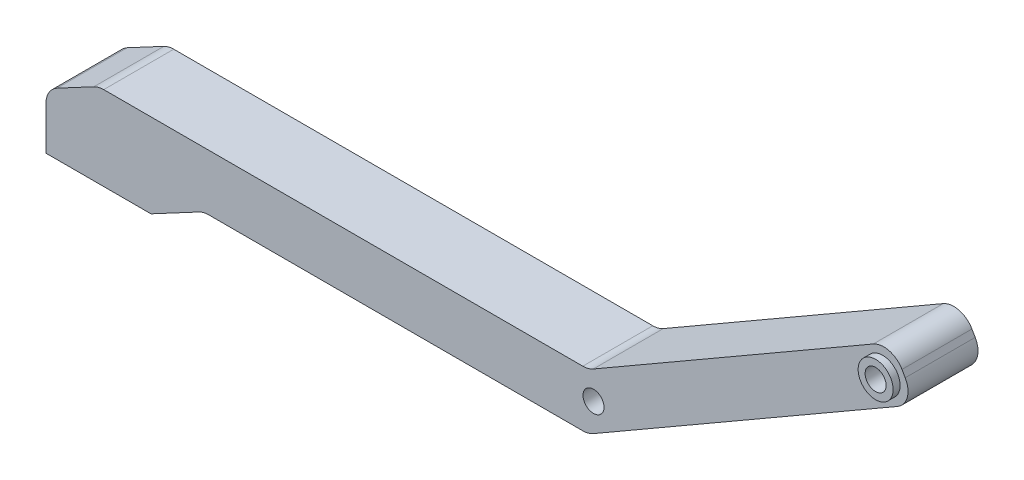
ISO-10303-21;
HEADER;
FILE_DESCRIPTION(('STEP AP214'),'2;1');
FILE_NAME('part.step','',(''),(''),'','','');
FILE_SCHEMA(('AUTOMOTIVE_DESIGN { 1 0 10303 214 1 1 1 1 }'));
ENDSEC;
DATA;
#1=APPLICATION_CONTEXT('core data for automotive mechanical design processes');
#2=APPLICATION_PROTOCOL_DEFINITION('international standard','automotive_design',2000,#1);
#3=PRODUCT_CONTEXT('',#1,'mechanical');
#4=PRODUCT('Part','Part','',(#3));
#5=PRODUCT_RELATED_PRODUCT_CATEGORY('part','',(#4));
#6=PRODUCT_DEFINITION_FORMATION('','',#4);
#7=PRODUCT_DEFINITION_CONTEXT('part definition',#1,'design');
#8=PRODUCT_DEFINITION('design','',#6,#7);
#9=PRODUCT_DEFINITION_SHAPE('','',#8);
#10=(LENGTH_UNIT() NAMED_UNIT(*) SI_UNIT(.MILLI.,.METRE.));
#11=(NAMED_UNIT(*) PLANE_ANGLE_UNIT() SI_UNIT($,.RADIAN.));
#12=(NAMED_UNIT(*) SI_UNIT($,.STERADIAN.) SOLID_ANGLE_UNIT());
#13=UNCERTAINTY_MEASURE_WITH_UNIT(LENGTH_MEASURE(1.E-05),#10,'distance_accuracy_value','');
#14=(GEOMETRIC_REPRESENTATION_CONTEXT(3) GLOBAL_UNCERTAINTY_ASSIGNED_CONTEXT((#13)) GLOBAL_UNIT_ASSIGNED_CONTEXT((#10,
#11,#12)) REPRESENTATION_CONTEXT('',''));
#15=CARTESIAN_POINT('',(0.,0.,0.));
#16=DIRECTION('',(0.,0.,1.));
#17=DIRECTION('',(1.,0.,0.));
#18=AXIS2_PLACEMENT_3D('',#15,#16,#17);
#19=CARTESIAN_POINT('',(0.,0.,10.));
#20=DIRECTION('',(0.,0.,1.));
#21=DIRECTION('',(1.,0.,0.));
#22=AXIS2_PLACEMENT_3D('',#19,#20,#21);
#23=PLANE('',#22);
#24=CARTESIAN_POINT('',(70.727461339179,4.42000000000001,10.));
#25=DIRECTION('',(0.,0.,1.));
#26=DIRECTION('',(1.,0.,0.));
#27=AXIS2_PLACEMENT_3D('',#24,#25,#26);
#28=CIRCLE('',#27,1.5);
#29=CARTESIAN_POINT('',(72.227461339179,4.42000000000001,10.));
#30=VERTEX_POINT('',#29);
#31=EDGE_CURVE('E351',#30,#30,#28,.T.);
#32=ORIENTED_EDGE('',*,*,#31,.F.);
#33=EDGE_LOOP('',(#32));
#34=FACE_BOUND('',#33,.T.);
#35=DIRECTION('',(-0.500000000000005,0.866025403784436,0.));
#36=VECTOR('',#35,1.);
#37=CARTESIAN_POINT('',(116.76537180436,27.,10.));
#38=LINE('',#37,#36);
#39=CARTESIAN_POINT('',(115.26537180436,29.5980762113533,10.));
#40=VERTEX_POINT('',#39);
#41=CARTESIAN_POINT('',(114.801270189222,30.4019237886467,10.));
#42=VERTEX_POINT('',#41);
#43=EDGE_CURVE('E333',#40,#42,#38,.T.);
#44=ORIENTED_EDGE('',*,*,#43,.T.);
#45=CARTESIAN_POINT('',(112.203193977869,28.9019237886467,10.));
#46=DIRECTION('',(0.,0.,1.));
#47=DIRECTION('',(1.,0.,0.));
#48=AXIS2_PLACEMENT_3D('',#45,#46,#47);
#49=CIRCLE('',#48,3.);
#50=CARTESIAN_POINT('',(110.703193977869,31.5,10.));
#51=VERTEX_POINT('',#50);
#52=EDGE_CURVE('E274',#42,#51,#49,.T.);
#53=ORIENTED_EDGE('',*,*,#52,.T.);
#54=DIRECTION('',(-0.866025403784439,-0.5,0.));
#55=VECTOR('',#54,1.);
#56=CARTESIAN_POINT('',(70.,8.,10.));
#57=LINE('',#56,#55);
#58=CARTESIAN_POINT('',(70.6961524227066,8.40192378864668,10.));
#59=VERTEX_POINT('',#58);
#60=EDGE_CURVE('E325',#51,#59,#57,.T.);
#61=ORIENTED_EDGE('',*,*,#60,.T.);
#62=CARTESIAN_POINT('',(69.1961524227066,11.,10.));
#63=DIRECTION('',(0.,0.,1.));
#64=DIRECTION('',(1.,0.,0.));
#65=AXIS2_PLACEMENT_3D('',#62,#63,#64);
#66=CIRCLE('',#65,3.);
#67=CARTESIAN_POINT('',(69.1961524227066,8.,10.));
#68=VERTEX_POINT('',#67);
#69=EDGE_CURVE('E11',#59,#68,#66,.F.);
#70=ORIENTED_EDGE('',*,*,#69,.T.);
#71=DIRECTION('',(-1.,0.,0.));
#72=VECTOR('',#71,1.);
#73=CARTESIAN_POINT('',(0.,8.,10.));
#74=LINE('',#73,#72);
#75=CARTESIAN_POINT('',(0.749999999999999,8.,10.));
#76=VERTEX_POINT('',#75);
#77=EDGE_CURVE('E323',#68,#76,#74,.T.);
#78=ORIENTED_EDGE('',*,*,#77,.T.);
#79=CARTESIAN_POINT('',(0.749999999999999,5.,10.));
#80=DIRECTION('',(0.,0.,1.));
#81=DIRECTION('',(1.,0.,0.));
#82=AXIS2_PLACEMENT_3D('',#79,#80,#81);
#83=CIRCLE('',#82,3.);
#84=CARTESIAN_POINT('',(-0.661764705882355,7.64705882352941,10.));
#85=VERTEX_POINT('',#84);
#86=EDGE_CURVE('E265',#76,#85,#83,.T.);
#87=ORIENTED_EDGE('',*,*,#86,.T.);
#88=DIRECTION('',(-0.882352941176471,-0.470588235294118,0.));
#89=VECTOR('',#88,1.);
#90=CARTESIAN_POINT('',(0.,8.,10.));
#91=LINE('',#90,#89);
#92=CARTESIAN_POINT('',(-5.91176470588236,4.84705882352941,10.));
#93=VERTEX_POINT('',#92);
#94=EDGE_CURVE('E169',#85,#93,#91,.T.);
#95=ORIENTED_EDGE('',*,*,#94,.T.);
#96=CARTESIAN_POINT('',(-4.5,2.2,10.));
#97=DIRECTION('',(0.,0.,1.));
#98=DIRECTION('',(1.,0.,0.));
#99=AXIS2_PLACEMENT_3D('',#96,#97,#98);
#100=CIRCLE('',#99,3.);
#101=CARTESIAN_POINT('',(-7.5,2.2,10.));
#102=VERTEX_POINT('',#101);
#103=EDGE_CURVE('E61',#93,#102,#100,.T.);
#104=ORIENTED_EDGE('',*,*,#103,.T.);
#105=DIRECTION('',(0.,-1.,0.));
#106=VECTOR('',#105,1.);
#107=CARTESIAN_POINT('',(-7.5,4.,10.));
#108=LINE('',#107,#106);
#109=CARTESIAN_POINT('',(-7.5,-4.,10.));
#110=VERTEX_POINT('',#109);
#111=EDGE_CURVE('E157',#102,#110,#108,.T.);
#112=ORIENTED_EDGE('',*,*,#111,.T.);
#113=DIRECTION('',(1.,0.,0.));
#114=VECTOR('',#113,1.);
#115=CARTESIAN_POINT('',(-7.5,-4.,10.));
#116=LINE('',#115,#114);
#117=CARTESIAN_POINT('',(7.5,-4.,10.));
#118=VERTEX_POINT('',#117);
#119=EDGE_CURVE('E163',#110,#118,#116,.T.);
#120=ORIENTED_EDGE('',*,*,#119,.T.);
#121=DIRECTION('',(0.882352941176471,0.470588235294118,0.));
#122=VECTOR('',#121,1.);
#123=CARTESIAN_POINT('',(7.5,-4.,10.));
#124=LINE('',#123,#122);
#125=CARTESIAN_POINT('',(14.3382352941176,-0.352941176470585,10.));
#126=VERTEX_POINT('',#125);
#127=EDGE_CURVE('E223',#118,#126,#124,.T.);
#128=ORIENTED_EDGE('',*,*,#127,.T.);
#129=CARTESIAN_POINT('',(15.75,-3.,10.));
#130=DIRECTION('',(0.,0.,1.));
#131=DIRECTION('',(1.,0.,0.));
#132=AXIS2_PLACEMENT_3D('',#129,#130,#131);
#133=CIRCLE('',#132,3.);
#134=CARTESIAN_POINT('',(15.75,0.,10.));
#135=VERTEX_POINT('',#134);
#136=EDGE_CURVE('E303',#126,#135,#133,.F.);
#137=ORIENTED_EDGE('',*,*,#136,.T.);
#138=DIRECTION('',(1.,0.,0.));
#139=VECTOR('',#138,1.);
#140=CARTESIAN_POINT('',(15.,0.,10.));
#141=LINE('',#140,#139);
#142=CARTESIAN_POINT('',(69.1961524227066,0.,10.));
#143=VERTEX_POINT('',#142);
#144=EDGE_CURVE('E342',#135,#143,#141,.T.);
#145=ORIENTED_EDGE('',*,*,#144,.T.);
#146=CARTESIAN_POINT('',(69.1961524227066,3.,10.));
#147=DIRECTION('',(0.,0.,1.));
#148=DIRECTION('',(1.,0.,0.));
#149=AXIS2_PLACEMENT_3D('',#146,#147,#148);
#150=CIRCLE('',#149,3.);
#151=CARTESIAN_POINT('',(70.6961524227066,0.40192378864668,10.));
#152=VERTEX_POINT('',#151);
#153=EDGE_CURVE('E268',#143,#152,#150,.T.);
#154=ORIENTED_EDGE('',*,*,#153,.T.);
#155=DIRECTION('',(0.866025403784439,0.5,0.));
#156=VECTOR('',#155,1.);
#157=CARTESIAN_POINT('',(70.,0.,10.));
#158=LINE('',#157,#156);
#159=CARTESIAN_POINT('',(114.167295593006,25.5,10.));
#160=VERTEX_POINT('',#159);
#161=EDGE_CURVE('E338',#152,#160,#158,.T.);
#162=ORIENTED_EDGE('',*,*,#161,.T.);
#163=CARTESIAN_POINT('',(112.667295593006,28.0980762113533,10.));
#164=DIRECTION('',(0.,0.,1.));
#165=DIRECTION('',(1.,0.,0.));
#166=AXIS2_PLACEMENT_3D('',#163,#164,#165);
#167=CIRCLE('',#166,3.);
#168=EDGE_CURVE('E271',#160,#40,#167,.T.);
#169=ORIENTED_EDGE('',*,*,#168,.T.);
#170=EDGE_LOOP('',(#44,#53,#61,#70,#78,#87,#95,#104,#112,#120,#128,#137,#145,#154,#162,#169));
#171=FACE_BOUND('',#170,.T.);
#172=CARTESIAN_POINT('',(112.036873099697,28.27,10.));
#173=DIRECTION('',(0.,0.,1.));
#174=DIRECTION('',(1.,0.,0.));
#175=AXIS2_PLACEMENT_3D('',#172,#173,#174);
#176=CIRCLE('',#175,2.5);
#177=CARTESIAN_POINT('',(114.536873099697,28.27,10.));
#178=VERTEX_POINT('',#177);
#179=EDGE_CURVE('E360',#178,#178,#176,.T.);
#180=ORIENTED_EDGE('',*,*,#179,.F.);
#181=EDGE_LOOP('',(#180));
#182=FACE_BOUND('',#181,.T.);
#183=ADVANCED_FACE('F45',(#34,#171,#182),#23,.T.);
#184=CARTESIAN_POINT('',(0.,0.,0.));
#185=DIRECTION('',(0.,0.,1.));
#186=DIRECTION('',(1.,0.,0.));
#187=AXIS2_PLACEMENT_3D('',#184,#185,#186);
#188=PLANE('',#187);
#189=DIRECTION('',(-0.866025403784439,-0.5,0.));
#190=VECTOR('',#189,1.);
#191=CARTESIAN_POINT('',(70.,8.,0.));
#192=LINE('',#191,#190);
#193=CARTESIAN_POINT('',(110.703193977869,31.5,0.));
#194=VERTEX_POINT('',#193);
#195=CARTESIAN_POINT('',(70.6961524227066,8.40192378864668,0.));
#196=VERTEX_POINT('',#195);
#197=EDGE_CURVE('E208',#194,#196,#192,.T.);
#198=ORIENTED_EDGE('',*,*,#197,.F.);
#199=CARTESIAN_POINT('',(112.203193977869,28.9019237886467,0.));
#200=DIRECTION('',(0.,0.,1.));
#201=DIRECTION('',(1.,0.,0.));
#202=AXIS2_PLACEMENT_3D('',#199,#200,#201);
#203=CIRCLE('',#202,3.);
#204=CARTESIAN_POINT('',(114.801270189222,30.4019237886467,0.));
#205=VERTEX_POINT('',#204);
#206=EDGE_CURVE('E253',#194,#205,#203,.F.);
#207=ORIENTED_EDGE('',*,*,#206,.T.);
#208=DIRECTION('',(-0.500000000000005,0.866025403784436,0.));
#209=VECTOR('',#208,1.);
#210=CARTESIAN_POINT('',(116.76537180436,27.,0.));
#211=LINE('',#210,#209);
#212=CARTESIAN_POINT('',(115.26537180436,29.5980762113533,0.));
#213=VERTEX_POINT('',#212);
#214=EDGE_CURVE('E204',#213,#205,#211,.T.);
#215=ORIENTED_EDGE('',*,*,#214,.F.);
#216=CARTESIAN_POINT('',(112.667295593006,28.0980762113533,0.));
#217=DIRECTION('',(0.,0.,1.));
#218=DIRECTION('',(1.,0.,0.));
#219=AXIS2_PLACEMENT_3D('',#216,#217,#218);
#220=CIRCLE('',#219,3.);
#221=CARTESIAN_POINT('',(114.167295593006,25.5,0.));
#222=VERTEX_POINT('',#221);
#223=EDGE_CURVE('E250',#213,#222,#220,.F.);
#224=ORIENTED_EDGE('',*,*,#223,.T.);
#225=DIRECTION('',(0.866025403784439,0.5,0.));
#226=VECTOR('',#225,1.);
#227=CARTESIAN_POINT('',(70.,0.,0.));
#228=LINE('',#227,#226);
#229=CARTESIAN_POINT('',(70.6961524227066,0.40192378864668,0.));
#230=VERTEX_POINT('',#229);
#231=EDGE_CURVE('E200',#230,#222,#228,.T.);
#232=ORIENTED_EDGE('',*,*,#231,.F.);
#233=CARTESIAN_POINT('',(69.1961524227066,3.,0.));
#234=DIRECTION('',(0.,0.,1.));
#235=DIRECTION('',(1.,0.,0.));
#236=AXIS2_PLACEMENT_3D('',#233,#234,#235);
#237=CIRCLE('',#236,3.);
#238=CARTESIAN_POINT('',(69.1961524227066,0.,0.));
#239=VERTEX_POINT('',#238);
#240=EDGE_CURVE('E247',#230,#239,#237,.F.);
#241=ORIENTED_EDGE('',*,*,#240,.T.);
#242=DIRECTION('',(1.,0.,0.));
#243=VECTOR('',#242,1.);
#244=CARTESIAN_POINT('',(15.,0.,0.));
#245=LINE('',#244,#243);
#246=CARTESIAN_POINT('',(15.75,0.,0.));
#247=VERTEX_POINT('',#246);
#248=EDGE_CURVE('E195',#247,#239,#245,.T.);
#249=ORIENTED_EDGE('',*,*,#248,.F.);
#250=CARTESIAN_POINT('',(15.75,-3.,0.));
#251=DIRECTION('',(0.,0.,1.));
#252=DIRECTION('',(1.,0.,0.));
#253=AXIS2_PLACEMENT_3D('',#250,#251,#252);
#254=CIRCLE('',#253,3.);
#255=CARTESIAN_POINT('',(14.3382352941176,-0.352941176470585,0.));
#256=VERTEX_POINT('',#255);
#257=EDGE_CURVE('E300',#247,#256,#254,.T.);
#258=ORIENTED_EDGE('',*,*,#257,.T.);
#259=DIRECTION('',(0.882352941176471,0.470588235294118,0.));
#260=VECTOR('',#259,1.);
#261=CARTESIAN_POINT('',(7.5,-4.,0.));
#262=LINE('',#261,#260);
#263=CARTESIAN_POINT('',(7.5,-4.,0.));
#264=VERTEX_POINT('',#263);
#265=EDGE_CURVE('E191',#264,#256,#262,.T.);
#266=ORIENTED_EDGE('',*,*,#265,.F.);
#267=DIRECTION('',(1.,0.,0.));
#268=VECTOR('',#267,1.);
#269=CARTESIAN_POINT('',(-7.5,-4.,0.));
#270=LINE('',#269,#268);
#271=CARTESIAN_POINT('',(-7.5,-4.,0.));
#272=VERTEX_POINT('',#271);
#273=EDGE_CURVE('E221',#272,#264,#270,.T.);
#274=ORIENTED_EDGE('',*,*,#273,.F.);
#275=DIRECTION('',(0.,-1.,0.));
#276=VECTOR('',#275,1.);
#277=CARTESIAN_POINT('',(-7.5,4.,0.));
#278=LINE('',#277,#276);
#279=CARTESIAN_POINT('',(-7.5,2.2,0.));
#280=VERTEX_POINT('',#279);
#281=EDGE_CURVE('E175',#280,#272,#278,.T.);
#282=ORIENTED_EDGE('',*,*,#281,.F.);
#283=CARTESIAN_POINT('',(-4.5,2.2,0.));
#284=DIRECTION('',(0.,0.,1.));
#285=DIRECTION('',(1.,0.,0.));
#286=AXIS2_PLACEMENT_3D('',#283,#284,#285);
#287=CIRCLE('',#286,3.);
#288=CARTESIAN_POINT('',(-5.91176470588236,4.84705882352941,0.));
#289=VERTEX_POINT('',#288);
#290=EDGE_CURVE('E241',#280,#289,#287,.F.);
#291=ORIENTED_EDGE('',*,*,#290,.T.);
#292=DIRECTION('',(-0.882352941176471,-0.470588235294118,0.));
#293=VECTOR('',#292,1.);
#294=CARTESIAN_POINT('',(0.,8.,0.));
#295=LINE('',#294,#293);
#296=CARTESIAN_POINT('',(-0.661764705882355,7.64705882352941,0.));
#297=VERTEX_POINT('',#296);
#298=EDGE_CURVE('E216',#297,#289,#295,.T.);
#299=ORIENTED_EDGE('',*,*,#298,.F.);
#300=CARTESIAN_POINT('',(0.749999999999999,5.,0.));
#301=DIRECTION('',(0.,0.,1.));
#302=DIRECTION('',(1.,0.,0.));
#303=AXIS2_PLACEMENT_3D('',#300,#301,#302);
#304=CIRCLE('',#303,3.);
#305=CARTESIAN_POINT('',(0.749999999999999,8.,0.));
#306=VERTEX_POINT('',#305);
#307=EDGE_CURVE('E244',#297,#306,#304,.F.);
#308=ORIENTED_EDGE('',*,*,#307,.T.);
#309=DIRECTION('',(-1.,0.,0.));
#310=VECTOR('',#309,1.);
#311=CARTESIAN_POINT('',(0.,8.,0.));
#312=LINE('',#311,#310);
#313=CARTESIAN_POINT('',(69.1961524227066,8.,0.));
#314=VERTEX_POINT('',#313);
#315=EDGE_CURVE('E212',#314,#306,#312,.T.);
#316=ORIENTED_EDGE('',*,*,#315,.F.);
#317=CARTESIAN_POINT('',(69.1961524227066,11.,0.));
#318=DIRECTION('',(0.,0.,1.));
#319=DIRECTION('',(1.,0.,0.));
#320=AXIS2_PLACEMENT_3D('',#317,#318,#319);
#321=CIRCLE('',#320,3.);
#322=EDGE_CURVE('E54',#314,#196,#321,.T.);
#323=ORIENTED_EDGE('',*,*,#322,.T.);
#324=EDGE_LOOP('',(#198,#207,#215,#224,#232,#241,#249,#258,#266,#274,#282,#291,#299,#308,#316,#323));
#325=FACE_BOUND('',#324,.T.);
#326=CARTESIAN_POINT('',(112.036873099697,28.27,0.));
#327=DIRECTION('',(0.,0.,1.));
#328=DIRECTION('',(1.,0.,0.));
#329=AXIS2_PLACEMENT_3D('',#326,#327,#328);
#330=CIRCLE('',#329,1.5);
#331=CARTESIAN_POINT('',(113.536873099697,28.27,0.));
#332=VERTEX_POINT('',#331);
#333=EDGE_CURVE('E196',#332,#332,#330,.T.);
#334=ORIENTED_EDGE('',*,*,#333,.T.);
#335=EDGE_LOOP('',(#334));
#336=FACE_BOUND('',#335,.T.);
#337=CARTESIAN_POINT('',(70.727461339179,4.42000000000001,0.));
#338=DIRECTION('',(0.,0.,1.));
#339=DIRECTION('',(1.,0.,0.));
#340=AXIS2_PLACEMENT_3D('',#337,#338,#339);
#341=CIRCLE('',#340,1.5);
#342=CARTESIAN_POINT('',(72.227461339179,4.42000000000001,0.));
#343=VERTEX_POINT('',#342);
#344=EDGE_CURVE('E352',#343,#343,#341,.T.);
#345=ORIENTED_EDGE('',*,*,#344,.T.);
#346=EDGE_LOOP('',(#345));
#347=FACE_BOUND('',#346,.T.);
#348=ADVANCED_FACE('F309',(#325,#336,#347),#188,.F.);
#349=CARTESIAN_POINT('',(7.5,-4.,10.));
#350=DIRECTION('',(-0.470588235294118,0.882352941176471,0.));
#351=DIRECTION('',(-0.882352941176471,-0.470588235294118,0.));
#352=AXIS2_PLACEMENT_3D('',#349,#350,#351);
#353=PLANE('',#352);
#354=ORIENTED_EDGE('',*,*,#265,.T.);
#355=DIRECTION('',(0.,0.,-1.));
#356=VECTOR('',#355,1.);
#357=CARTESIAN_POINT('',(14.3382352941176,-0.352941176470585,10.));
#358=LINE('',#357,#356);
#359=EDGE_CURVE('E231',#256,#126,#358,.F.);
#360=ORIENTED_EDGE('',*,*,#359,.T.);
#361=ORIENTED_EDGE('',*,*,#127,.F.);
#362=DIRECTION('',(0.,0.,-1.));
#363=VECTOR('',#362,1.);
#364=CARTESIAN_POINT('',(7.5,-4.,10.));
#365=LINE('',#364,#363);
#366=EDGE_CURVE('E180',#118,#264,#365,.T.);
#367=ORIENTED_EDGE('',*,*,#366,.T.);
#368=EDGE_LOOP('',(#354,#360,#361,#367));
#369=FACE_BOUND('',#368,.T.);
#370=ADVANCED_FACE('F394',(#369),#353,.F.);
#371=CARTESIAN_POINT('',(15.,0.,10.));
#372=DIRECTION('',(0.,1.,0.));
#373=DIRECTION('',(-1.,0.,0.));
#374=AXIS2_PLACEMENT_3D('',#371,#372,#373);
#375=PLANE('',#374);
#376=ORIENTED_EDGE('',*,*,#144,.F.);
#377=DIRECTION('',(0.,0.,-1.));
#378=VECTOR('',#377,1.);
#379=CARTESIAN_POINT('',(15.75,0.,0.));
#380=LINE('',#379,#378);
#381=EDGE_CURVE('E227',#135,#247,#380,.T.);
#382=ORIENTED_EDGE('',*,*,#381,.T.);
#383=ORIENTED_EDGE('',*,*,#248,.T.);
#384=DIRECTION('',(0.,0.,-1.));
#385=VECTOR('',#384,1.);
#386=CARTESIAN_POINT('',(69.1961524227066,0.,10.));
#387=LINE('',#386,#385);
#388=EDGE_CURVE('E179',#239,#143,#387,.F.);
#389=ORIENTED_EDGE('',*,*,#388,.T.);
#390=EDGE_LOOP('',(#376,#382,#383,#389));
#391=FACE_BOUND('',#390,.T.);
#392=ADVANCED_FACE('F418',(#391),#375,.F.);
#393=CARTESIAN_POINT('',(70.,0.,10.));
#394=DIRECTION('',(-0.5,0.866025403784439,0.));
#395=DIRECTION('',(-0.866025403784439,-0.5,0.));
#396=AXIS2_PLACEMENT_3D('',#393,#394,#395);
#397=PLANE('',#396);
#398=ORIENTED_EDGE('',*,*,#231,.T.);
#399=DIRECTION('',(0.,0.,-1.));
#400=VECTOR('',#399,1.);
#401=CARTESIAN_POINT('',(114.167295593006,25.5,10.));
#402=LINE('',#401,#400);
#403=EDGE_CURVE('E281',#222,#160,#402,.F.);
#404=ORIENTED_EDGE('',*,*,#403,.T.);
#405=ORIENTED_EDGE('',*,*,#161,.F.);
#406=DIRECTION('',(0.,0.,-1.));
#407=VECTOR('',#406,1.);
#408=CARTESIAN_POINT('',(70.6961524227066,0.40192378864668,10.));
#409=LINE('',#408,#407);
#410=EDGE_CURVE('E277',#152,#230,#409,.T.);
#411=ORIENTED_EDGE('',*,*,#410,.T.);
#412=EDGE_LOOP('',(#398,#404,#405,#411));
#413=FACE_BOUND('',#412,.T.);
#414=ADVANCED_FACE('F414',(#413),#397,.F.);
#415=CARTESIAN_POINT('',(116.76537180436,27.,10.));
#416=DIRECTION('',(-0.866025403784436,-0.500000000000004,0.));
#417=DIRECTION('',(0.500000000000004,-0.866025403784436,0.));
#418=AXIS2_PLACEMENT_3D('',#415,#416,#417);
#419=PLANE('',#418);
#420=ORIENTED_EDGE('',*,*,#214,.T.);
#421=DIRECTION('',(0.,0.,-1.));
#422=VECTOR('',#421,1.);
#423=CARTESIAN_POINT('',(114.801270189222,30.4019237886467,10.));
#424=LINE('',#423,#422);
#425=EDGE_CURVE('E260',#205,#42,#424,.F.);
#426=ORIENTED_EDGE('',*,*,#425,.T.);
#427=ORIENTED_EDGE('',*,*,#43,.F.);
#428=DIRECTION('',(0.,0.,-1.));
#429=VECTOR('',#428,1.);
#430=CARTESIAN_POINT('',(115.26537180436,29.5980762113533,10.));
#431=LINE('',#430,#429);
#432=EDGE_CURVE('E256',#40,#213,#431,.T.);
#433=ORIENTED_EDGE('',*,*,#432,.T.);
#434=EDGE_LOOP('',(#420,#426,#427,#433));
#435=FACE_BOUND('',#434,.T.);
#436=ADVANCED_FACE('F411',(#435),#419,.F.);
#437=CARTESIAN_POINT('',(70.,8.,10.));
#438=DIRECTION('',(0.5,-0.866025403784439,0.));
#439=DIRECTION('',(0.866025403784439,0.5,0.));
#440=AXIS2_PLACEMENT_3D('',#437,#438,#439);
#441=PLANE('',#440);
#442=ORIENTED_EDGE('',*,*,#60,.F.);
#443=DIRECTION('',(0.,0.,-1.));
#444=VECTOR('',#443,1.);
#445=CARTESIAN_POINT('',(110.703193977869,31.5,10.));
#446=LINE('',#445,#444);
#447=EDGE_CURVE('E237',#51,#194,#446,.T.);
#448=ORIENTED_EDGE('',*,*,#447,.T.);
#449=ORIENTED_EDGE('',*,*,#197,.T.);
#450=DIRECTION('',(0.,0.,-1.));
#451=VECTOR('',#450,1.);
#452=CARTESIAN_POINT('',(70.6961524227066,8.40192378864668,10.));
#453=LINE('',#452,#451);
#454=EDGE_CURVE('E234',#196,#59,#453,.F.);
#455=ORIENTED_EDGE('',*,*,#454,.T.);
#456=EDGE_LOOP('',(#442,#448,#449,#455));
#457=FACE_BOUND('',#456,.T.);
#458=ADVANCED_FACE('F316',(#457),#441,.F.);
#459=CARTESIAN_POINT('',(0.,8.,10.));
#460=DIRECTION('',(0.,-1.,0.));
#461=DIRECTION('',(0.,0.,-1.));
#462=AXIS2_PLACEMENT_3D('',#459,#460,#461);
#463=PLANE('',#462);
#464=ORIENTED_EDGE('',*,*,#77,.F.);
#465=DIRECTION('',(0.,0.,-1.));
#466=VECTOR('',#465,1.);
#467=CARTESIAN_POINT('',(69.1961524227066,8.,0.));
#468=LINE('',#467,#466);
#469=EDGE_CURVE('E287',#68,#314,#468,.T.);
#470=ORIENTED_EDGE('',*,*,#469,.T.);
#471=ORIENTED_EDGE('',*,*,#315,.T.);
#472=DIRECTION('',(0.,0.,-1.));
#473=VECTOR('',#472,1.);
#474=CARTESIAN_POINT('',(0.749999999999999,8.,10.));
#475=LINE('',#474,#473);
#476=EDGE_CURVE('E284',#306,#76,#475,.F.);
#477=ORIENTED_EDGE('',*,*,#476,.T.);
#478=EDGE_LOOP('',(#464,#470,#471,#477));
#479=FACE_BOUND('',#478,.T.);
#480=ADVANCED_FACE('F327',(#479),#463,.F.);
#481=CARTESIAN_POINT('',(0.,8.,10.));
#482=DIRECTION('',(0.470588235294118,-0.882352941176471,0.));
#483=DIRECTION('',(0.882352941176471,0.470588235294118,0.));
#484=AXIS2_PLACEMENT_3D('',#481,#482,#483);
#485=PLANE('',#484);
#486=ORIENTED_EDGE('',*,*,#94,.F.);
#487=DIRECTION('',(0.,0.,-1.));
#488=VECTOR('',#487,1.);
#489=CARTESIAN_POINT('',(-0.661764705882354,7.64705882352941,10.));
#490=LINE('',#489,#488);
#491=EDGE_CURVE('E293',#85,#297,#490,.T.);
#492=ORIENTED_EDGE('',*,*,#491,.T.);
#493=ORIENTED_EDGE('',*,*,#298,.T.);
#494=DIRECTION('',(0.,0.,-1.));
#495=VECTOR('',#494,1.);
#496=CARTESIAN_POINT('',(-5.91176470588236,4.84705882352941,10.));
#497=LINE('',#496,#495);
#498=EDGE_CURVE('E69',#289,#93,#497,.F.);
#499=ORIENTED_EDGE('',*,*,#498,.T.);
#500=EDGE_LOOP('',(#486,#492,#493,#499));
#501=FACE_BOUND('',#500,.T.);
#502=ADVANCED_FACE('F404',(#501),#485,.F.);
#503=CARTESIAN_POINT('',(-7.5,4.,10.));
#504=DIRECTION('',(1.,0.,0.));
#505=DIRECTION('',(0.,0.,-1.));
#506=AXIS2_PLACEMENT_3D('',#503,#504,#505);
#507=PLANE('',#506);
#508=ORIENTED_EDGE('',*,*,#111,.F.);
#509=DIRECTION('',(0.,0.,-1.));
#510=VECTOR('',#509,1.);
#511=CARTESIAN_POINT('',(-7.5,2.2,10.));
#512=LINE('',#511,#510);
#513=EDGE_CURVE('E297',#102,#280,#512,.T.);
#514=ORIENTED_EDGE('',*,*,#513,.T.);
#515=ORIENTED_EDGE('',*,*,#281,.T.);
#516=DIRECTION('',(0.,0.,-1.));
#517=VECTOR('',#516,1.);
#518=CARTESIAN_POINT('',(-7.5,-4.,10.));
#519=LINE('',#518,#517);
#520=EDGE_CURVE('E172',#110,#272,#519,.T.);
#521=ORIENTED_EDGE('',*,*,#520,.F.);
#522=EDGE_LOOP('',(#508,#514,#515,#521));
#523=FACE_BOUND('',#522,.T.);
#524=ADVANCED_FACE('F173',(#523),#507,.F.);
#525=CARTESIAN_POINT('',(-7.5,-4.,10.));
#526=DIRECTION('',(0.,1.,0.));
#527=DIRECTION('',(0.,0.,1.));
#528=AXIS2_PLACEMENT_3D('',#525,#526,#527);
#529=PLANE('',#528);
#530=ORIENTED_EDGE('',*,*,#273,.T.);
#531=ORIENTED_EDGE('',*,*,#366,.F.);
#532=ORIENTED_EDGE('',*,*,#119,.F.);
#533=ORIENTED_EDGE('',*,*,#520,.T.);
#534=EDGE_LOOP('',(#530,#531,#532,#533));
#535=FACE_BOUND('',#534,.T.);
#536=ADVANCED_FACE('F182',(#535),#529,.F.);
#537=CARTESIAN_POINT('',(112.036873099697,28.27,10.));
#538=DIRECTION('',(0.,0.,-1.));
#539=DIRECTION('',(-1.,0.,0.));
#540=AXIS2_PLACEMENT_3D('',#537,#538,#539);
#541=CYLINDRICAL_SURFACE('',#540,1.5);
#542=ORIENTED_EDGE('',*,*,#333,.F.);
#543=EDGE_LOOP('',(#542));
#544=FACE_BOUND('',#543,.T.);
#545=CARTESIAN_POINT('',(112.036873099697,28.27,11.));
#546=DIRECTION('',(0.,0.,1.));
#547=DIRECTION('',(1.,0.,0.));
#548=AXIS2_PLACEMENT_3D('',#545,#546,#547);
#549=CIRCLE('',#548,1.5);
#550=CARTESIAN_POINT('',(113.536873099697,28.27,11.));
#551=VERTEX_POINT('',#550);
#552=EDGE_CURVE('E364',#551,#551,#549,.T.);
#553=ORIENTED_EDGE('',*,*,#552,.T.);
#554=EDGE_LOOP('',(#553));
#555=FACE_BOUND('',#554,.T.);
#556=ADVANCED_FACE('F372',(#544,#555),#541,.F.);
#557=CARTESIAN_POINT('',(70.727461339179,4.42000000000001,10.));
#558=DIRECTION('',(0.,0.,-1.));
#559=DIRECTION('',(-1.,0.,0.));
#560=AXIS2_PLACEMENT_3D('',#557,#558,#559);
#561=CYLINDRICAL_SURFACE('',#560,1.5);
#562=ORIENTED_EDGE('',*,*,#31,.T.);
#563=EDGE_LOOP('',(#562));
#564=FACE_BOUND('',#563,.T.);
#565=ORIENTED_EDGE('',*,*,#344,.F.);
#566=EDGE_LOOP('',(#565));
#567=FACE_BOUND('',#566,.T.);
#568=ADVANCED_FACE('F430',(#564,#567),#561,.F.);
#569=CARTESIAN_POINT('',(15.75,-3.,10.));
#570=DIRECTION('',(0.,0.,1.));
#571=DIRECTION('',(1.,0.,0.));
#572=AXIS2_PLACEMENT_3D('',#569,#570,#571);
#573=CYLINDRICAL_SURFACE('',#572,3.);
#574=ORIENTED_EDGE('',*,*,#136,.F.);
#575=ORIENTED_EDGE('',*,*,#359,.F.);
#576=ORIENTED_EDGE('',*,*,#257,.F.);
#577=ORIENTED_EDGE('',*,*,#381,.F.);
#578=EDGE_LOOP('',(#574,#575,#576,#577));
#579=FACE_BOUND('',#578,.T.);
#580=ADVANCED_FACE('F426',(#579),#573,.F.);
#581=CARTESIAN_POINT('',(112.203193977869,28.9019237886467,10.));
#582=DIRECTION('',(0.,0.,-1.));
#583=DIRECTION('',(-1.,0.,0.));
#584=AXIS2_PLACEMENT_3D('',#581,#582,#583);
#585=CYLINDRICAL_SURFACE('',#584,3.);
#586=ORIENTED_EDGE('',*,*,#52,.F.);
#587=ORIENTED_EDGE('',*,*,#425,.F.);
#588=ORIENTED_EDGE('',*,*,#206,.F.);
#589=ORIENTED_EDGE('',*,*,#447,.F.);
#590=EDGE_LOOP('',(#586,#587,#588,#589));
#591=FACE_BOUND('',#590,.T.);
#592=ADVANCED_FACE('F429',(#591),#585,.T.);
#593=CARTESIAN_POINT('',(112.667295593006,28.0980762113533,10.));
#594=DIRECTION('',(0.,0.,-1.));
#595=DIRECTION('',(-1.,0.,0.));
#596=AXIS2_PLACEMENT_3D('',#593,#594,#595);
#597=CYLINDRICAL_SURFACE('',#596,3.);
#598=ORIENTED_EDGE('',*,*,#168,.F.);
#599=ORIENTED_EDGE('',*,*,#403,.F.);
#600=ORIENTED_EDGE('',*,*,#223,.F.);
#601=ORIENTED_EDGE('',*,*,#432,.F.);
#602=EDGE_LOOP('',(#598,#599,#600,#601));
#603=FACE_BOUND('',#602,.T.);
#604=ADVANCED_FACE('F434',(#603),#597,.T.);
#605=CARTESIAN_POINT('',(69.1961524227066,3.,10.));
#606=DIRECTION('',(0.,0.,-1.));
#607=DIRECTION('',(-1.,0.,0.));
#608=AXIS2_PLACEMENT_3D('',#605,#606,#607);
#609=CYLINDRICAL_SURFACE('',#608,3.);
#610=ORIENTED_EDGE('',*,*,#153,.F.);
#611=ORIENTED_EDGE('',*,*,#388,.F.);
#612=ORIENTED_EDGE('',*,*,#240,.F.);
#613=ORIENTED_EDGE('',*,*,#410,.F.);
#614=EDGE_LOOP('',(#610,#611,#612,#613));
#615=FACE_BOUND('',#614,.T.);
#616=ADVANCED_FACE('F438',(#615),#609,.T.);
#617=CARTESIAN_POINT('',(69.1961524227066,11.,10.));
#618=DIRECTION('',(0.,0.,1.));
#619=DIRECTION('',(1.,0.,0.));
#620=AXIS2_PLACEMENT_3D('',#617,#618,#619);
#621=CYLINDRICAL_SURFACE('',#620,3.);
#622=ORIENTED_EDGE('',*,*,#69,.F.);
#623=ORIENTED_EDGE('',*,*,#454,.F.);
#624=ORIENTED_EDGE('',*,*,#322,.F.);
#625=ORIENTED_EDGE('',*,*,#469,.F.);
#626=EDGE_LOOP('',(#622,#623,#624,#625));
#627=FACE_BOUND('',#626,.T.);
#628=ADVANCED_FACE('F320',(#627),#621,.F.);
#629=CARTESIAN_POINT('',(0.749999999999999,5.,10.));
#630=DIRECTION('',(0.,0.,-1.));
#631=DIRECTION('',(-1.,0.,0.));
#632=AXIS2_PLACEMENT_3D('',#629,#630,#631);
#633=CYLINDRICAL_SURFACE('',#632,3.);
#634=ORIENTED_EDGE('',*,*,#86,.F.);
#635=ORIENTED_EDGE('',*,*,#476,.F.);
#636=ORIENTED_EDGE('',*,*,#307,.F.);
#637=ORIENTED_EDGE('',*,*,#491,.F.);
#638=EDGE_LOOP('',(#634,#635,#636,#637));
#639=FACE_BOUND('',#638,.T.);
#640=ADVANCED_FACE('F386',(#639),#633,.T.);
#641=CARTESIAN_POINT('',(-4.5,2.2,10.));
#642=DIRECTION('',(0.,0.,-1.));
#643=DIRECTION('',(-1.,0.,0.));
#644=AXIS2_PLACEMENT_3D('',#641,#642,#643);
#645=CYLINDRICAL_SURFACE('',#644,3.);
#646=ORIENTED_EDGE('',*,*,#103,.F.);
#647=ORIENTED_EDGE('',*,*,#498,.F.);
#648=ORIENTED_EDGE('',*,*,#290,.F.);
#649=ORIENTED_EDGE('',*,*,#513,.F.);
#650=EDGE_LOOP('',(#646,#647,#648,#649));
#651=FACE_BOUND('',#650,.T.);
#652=ADVANCED_FACE('F47',(#651),#645,.T.);
#653=CARTESIAN_POINT('',(112.036873099697,28.27,11.));
#654=DIRECTION('',(0.,0.,1.));
#655=DIRECTION('',(1.,0.,0.));
#656=AXIS2_PLACEMENT_3D('',#653,#654,#655);
#657=PLANE('',#656);
#658=CARTESIAN_POINT('',(112.036873099697,28.27,11.));
#659=DIRECTION('',(0.,0.,1.));
#660=DIRECTION('',(1.,0.,0.));
#661=AXIS2_PLACEMENT_3D('',#658,#659,#660);
#662=CIRCLE('',#661,2.5);
#663=CARTESIAN_POINT('',(114.536873099697,28.27,11.));
#664=VERTEX_POINT('',#663);
#665=EDGE_CURVE('E356',#664,#664,#662,.T.);
#666=ORIENTED_EDGE('',*,*,#665,.T.);
#667=EDGE_LOOP('',(#666));
#668=FACE_BOUND('',#667,.T.);
#669=ORIENTED_EDGE('',*,*,#552,.F.);
#670=EDGE_LOOP('',(#669));
#671=FACE_BOUND('',#670,.T.);
#672=ADVANCED_FACE('F374',(#668,#671),#657,.T.);
#673=CARTESIAN_POINT('',(112.036873099697,28.27,11.));
#674=DIRECTION('',(0.,0.,-1.));
#675=DIRECTION('',(-1.,0.,0.));
#676=AXIS2_PLACEMENT_3D('',#673,#674,#675);
#677=CYLINDRICAL_SURFACE('',#676,2.5);
#678=ORIENTED_EDGE('',*,*,#665,.F.);
#679=EDGE_LOOP('',(#678));
#680=FACE_BOUND('',#679,.T.);
#681=ORIENTED_EDGE('',*,*,#179,.T.);
#682=EDGE_LOOP('',(#681));
#683=FACE_BOUND('',#682,.T.);
#684=ADVANCED_FACE('F376',(#680,#683),#677,.T.);
#685=CLOSED_SHELL('',(#183,#348,#370,#392,#414,#436,#458,#480,#502,#524,#536,#556,#568,#580,
#592,#604,#616,#628,#640,#652,#672,#684));
#686=MANIFOLD_SOLID_BREP('B2',#685);
#687=ADVANCED_BREP_SHAPE_REPRESENTATION('',(#18,#686),#14);
#688=SHAPE_DEFINITION_REPRESENTATION(#9,#687);
ENDSEC;
END-ISO-10303-21;
